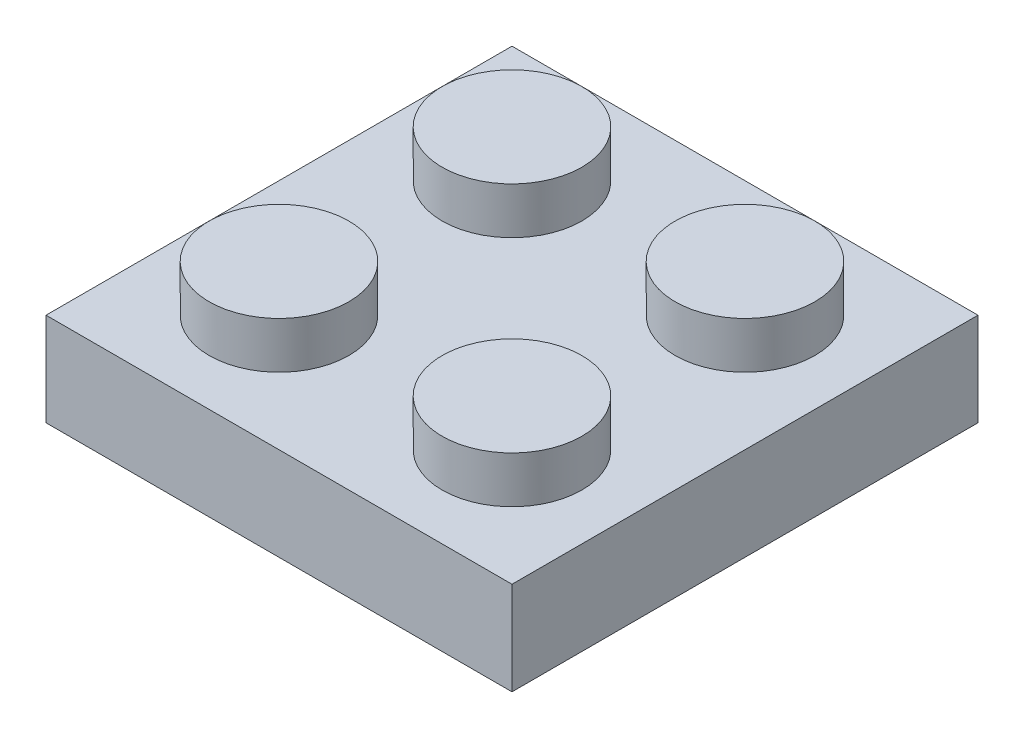
ISO-10303-21;
HEADER;
FILE_DESCRIPTION(('STEP AP214'),'2;1');
FILE_NAME('part.step','',(''),(''),'','','');
FILE_SCHEMA(('AUTOMOTIVE_DESIGN { 1 0 10303 214 1 1 1 1 }'));
ENDSEC;
DATA;
#1=APPLICATION_CONTEXT('core data for automotive mechanical design processes');
#2=APPLICATION_PROTOCOL_DEFINITION('international standard','automotive_design',2000,#1);
#3=PRODUCT_CONTEXT('',#1,'mechanical');
#4=PRODUCT('Part','Part','',(#3));
#5=PRODUCT_RELATED_PRODUCT_CATEGORY('part','',(#4));
#6=PRODUCT_DEFINITION_FORMATION('','',#4);
#7=PRODUCT_DEFINITION_CONTEXT('part definition',#1,'design');
#8=PRODUCT_DEFINITION('design','',#6,#7);
#9=PRODUCT_DEFINITION_SHAPE('','',#8);
#10=(LENGTH_UNIT() NAMED_UNIT(*) SI_UNIT(.MILLI.,.METRE.));
#11=(NAMED_UNIT(*) PLANE_ANGLE_UNIT() SI_UNIT($,.RADIAN.));
#12=(NAMED_UNIT(*) SI_UNIT($,.STERADIAN.) SOLID_ANGLE_UNIT());
#13=UNCERTAINTY_MEASURE_WITH_UNIT(LENGTH_MEASURE(1.E-05),#10,'distance_accuracy_value','');
#14=(GEOMETRIC_REPRESENTATION_CONTEXT(3) GLOBAL_UNCERTAINTY_ASSIGNED_CONTEXT((#13)) GLOBAL_UNIT_ASSIGNED_CONTEXT((#10,
#11,#12)) REPRESENTATION_CONTEXT('',''));
#15=CARTESIAN_POINT('',(0.,0.,0.));
#16=DIRECTION('',(0.,0.,1.));
#17=DIRECTION('',(1.,0.,0.));
#18=AXIS2_PLACEMENT_3D('',#15,#16,#17);
#19=CARTESIAN_POINT('',(12.,1.6,4.));
#20=DIRECTION('',(-1.,0.,0.));
#21=DIRECTION('',(0.,0.,1.));
#22=AXIS2_PLACEMENT_3D('',#19,#20,#21);
#23=PLANE('',#22);
#24=DIRECTION('',(0.,0.,-1.));
#25=VECTOR('',#24,1.);
#26=CARTESIAN_POINT('',(12.,0.,4.));
#27=LINE('',#26,#25);
#28=CARTESIAN_POINT('',(12.,0.,12.));
#29=VERTEX_POINT('',#28);
#30=CARTESIAN_POINT('',(12.,0.,-4.));
#31=VERTEX_POINT('',#30);
#32=EDGE_CURVE('E116',#29,#31,#27,.T.);
#33=ORIENTED_EDGE('',*,*,#32,.T.);
#34=DIRECTION('',(0.,-1.,0.));
#35=VECTOR('',#34,1.);
#36=CARTESIAN_POINT('',(12.,1.6,-4.));
#37=LINE('',#36,#35);
#38=CARTESIAN_POINT('',(12.,3.2,-4.));
#39=VERTEX_POINT('',#38);
#40=EDGE_CURVE('E158',#39,#31,#37,.T.);
#41=ORIENTED_EDGE('',*,*,#40,.F.);
#42=DIRECTION('',(0.,0.,-1.));
#43=VECTOR('',#42,1.);
#44=CARTESIAN_POINT('',(12.,3.2,4.));
#45=LINE('',#44,#43);
#46=CARTESIAN_POINT('',(12.,3.2,12.));
#47=VERTEX_POINT('',#46);
#48=EDGE_CURVE('E11',#47,#39,#45,.T.);
#49=ORIENTED_EDGE('',*,*,#48,.F.);
#50=DIRECTION('',(0.,1.,0.));
#51=VECTOR('',#50,1.);
#52=CARTESIAN_POINT('',(12.,1.6,12.));
#53=LINE('',#52,#51);
#54=EDGE_CURVE('E21',#29,#47,#53,.T.);
#55=ORIENTED_EDGE('',*,*,#54,.F.);
#56=EDGE_LOOP('',(#33,#41,#49,#55));
#57=FACE_BOUND('',#56,.T.);
#58=ADVANCED_FACE('F17',(#57),#23,.F.);
#59=CARTESIAN_POINT('',(4.,3.2,4.));
#60=DIRECTION('',(0.,-1.,0.));
#61=DIRECTION('',(0.,0.,-1.));
#62=AXIS2_PLACEMENT_3D('',#59,#60,#61);
#63=PLANE('',#62);
#64=ORIENTED_EDGE('',*,*,#48,.T.);
#65=DIRECTION('',(1.,0.,0.));
#66=VECTOR('',#65,1.);
#67=CARTESIAN_POINT('',(4.,3.2,-4.));
#68=LINE('',#67,#66);
#69=CARTESIAN_POINT('',(-4.,3.2,-4.));
#70=VERTEX_POINT('',#69);
#71=EDGE_CURVE('E138',#70,#39,#68,.T.);
#72=ORIENTED_EDGE('',*,*,#71,.F.);
#73=DIRECTION('',(0.,0.,-1.));
#74=VECTOR('',#73,1.);
#75=CARTESIAN_POINT('',(-4.,3.2,4.));
#76=LINE('',#75,#74);
#77=CARTESIAN_POINT('',(-4.,3.2,12.));
#78=VERTEX_POINT('',#77);
#79=EDGE_CURVE('E27',#78,#70,#76,.T.);
#80=ORIENTED_EDGE('',*,*,#79,.F.);
#81=DIRECTION('',(-1.,0.,0.));
#82=VECTOR('',#81,1.);
#83=CARTESIAN_POINT('',(4.,3.2,12.));
#84=LINE('',#83,#82);
#85=EDGE_CURVE('E131',#47,#78,#84,.T.);
#86=ORIENTED_EDGE('',*,*,#85,.F.);
#87=EDGE_LOOP('',(#64,#72,#80,#86));
#88=FACE_BOUND('',#87,.T.);
#89=CARTESIAN_POINT('',(0.,3.2,0.));
#90=DIRECTION('',(0.,-1.,0.));
#91=DIRECTION('',(1.,0.,0.));
#92=AXIS2_PLACEMENT_3D('',#89,#90,#91);
#93=CIRCLE('',#92,2.4);
#94=CARTESIAN_POINT('',(-2.4,3.2,0.));
#95=VERTEX_POINT('',#94);
#96=EDGE_CURVE('E143',#95,#95,#93,.T.);
#97=ORIENTED_EDGE('',*,*,#96,.T.);
#98=EDGE_LOOP('',(#97));
#99=FACE_BOUND('',#98,.T.);
#100=CARTESIAN_POINT('',(0.,3.2,8.));
#101=DIRECTION('',(0.,-1.,0.));
#102=DIRECTION('',(1.,0.,0.));
#103=AXIS2_PLACEMENT_3D('',#100,#101,#102);
#104=CIRCLE('',#103,2.4);
#105=CARTESIAN_POINT('',(-2.4,3.2,8.));
#106=VERTEX_POINT('',#105);
#107=EDGE_CURVE('E144',#106,#106,#104,.T.);
#108=ORIENTED_EDGE('',*,*,#107,.T.);
#109=EDGE_LOOP('',(#108));
#110=FACE_BOUND('',#109,.T.);
#111=CARTESIAN_POINT('',(8.,3.2,0.));
#112=DIRECTION('',(0.,-1.,0.));
#113=DIRECTION('',(1.,0.,0.));
#114=AXIS2_PLACEMENT_3D('',#111,#112,#113);
#115=CIRCLE('',#114,2.4);
#116=CARTESIAN_POINT('',(5.6,3.2,0.));
#117=VERTEX_POINT('',#116);
#118=EDGE_CURVE('E84',#117,#117,#115,.T.);
#119=ORIENTED_EDGE('',*,*,#118,.T.);
#120=EDGE_LOOP('',(#119));
#121=FACE_BOUND('',#120,.T.);
#122=CARTESIAN_POINT('',(8.,3.2,8.));
#123=DIRECTION('',(0.,-1.,0.));
#124=DIRECTION('',(1.,0.,0.));
#125=AXIS2_PLACEMENT_3D('',#122,#123,#124);
#126=CIRCLE('',#125,2.4);
#127=CARTESIAN_POINT('',(5.6,3.2,8.));
#128=VERTEX_POINT('',#127);
#129=EDGE_CURVE('E109',#128,#128,#126,.T.);
#130=ORIENTED_EDGE('',*,*,#129,.T.);
#131=EDGE_LOOP('',(#130));
#132=FACE_BOUND('',#131,.T.);
#133=ADVANCED_FACE('F180',(#88,#99,#110,#121,#132),#63,.F.);
#134=CARTESIAN_POINT('',(-4.,1.6,4.));
#135=DIRECTION('',(1.,0.,0.));
#136=DIRECTION('',(0.,0.,-1.));
#137=AXIS2_PLACEMENT_3D('',#134,#135,#136);
#138=PLANE('',#137);
#139=ORIENTED_EDGE('',*,*,#79,.T.);
#140=DIRECTION('',(0.,1.,0.));
#141=VECTOR('',#140,1.);
#142=CARTESIAN_POINT('',(-4.,1.6,-4.));
#143=LINE('',#142,#141);
#144=CARTESIAN_POINT('',(-4.,0.,-4.));
#145=VERTEX_POINT('',#144);
#146=EDGE_CURVE('E135',#145,#70,#143,.T.);
#147=ORIENTED_EDGE('',*,*,#146,.F.);
#148=DIRECTION('',(0.,0.,-1.));
#149=VECTOR('',#148,1.);
#150=CARTESIAN_POINT('',(-4.,0.,4.));
#151=LINE('',#150,#149);
#152=CARTESIAN_POINT('',(-4.,0.,12.));
#153=VERTEX_POINT('',#152);
#154=EDGE_CURVE('E146',#153,#145,#151,.T.);
#155=ORIENTED_EDGE('',*,*,#154,.F.);
#156=DIRECTION('',(0.,-1.,0.));
#157=VECTOR('',#156,1.);
#158=CARTESIAN_POINT('',(-4.,1.6,12.));
#159=LINE('',#158,#157);
#160=EDGE_CURVE('E134',#78,#153,#159,.T.);
#161=ORIENTED_EDGE('',*,*,#160,.F.);
#162=EDGE_LOOP('',(#139,#147,#155,#161));
#163=FACE_BOUND('',#162,.T.);
#164=ADVANCED_FACE('F19',(#163),#138,.F.);
#165=CARTESIAN_POINT('',(4.,0.,4.));
#166=DIRECTION('',(0.,1.,0.));
#167=DIRECTION('',(0.,0.,1.));
#168=AXIS2_PLACEMENT_3D('',#165,#166,#167);
#169=PLANE('',#168);
#170=ORIENTED_EDGE('',*,*,#154,.T.);
#171=DIRECTION('',(-1.,0.,0.));
#172=VECTOR('',#171,1.);
#173=CARTESIAN_POINT('',(4.,0.,-4.));
#174=LINE('',#173,#172);
#175=EDGE_CURVE('E139',#31,#145,#174,.T.);
#176=ORIENTED_EDGE('',*,*,#175,.F.);
#177=ORIENTED_EDGE('',*,*,#32,.F.);
#178=DIRECTION('',(1.,0.,0.));
#179=VECTOR('',#178,1.);
#180=CARTESIAN_POINT('',(4.,0.,12.));
#181=LINE('',#180,#179);
#182=EDGE_CURVE('E151',#153,#29,#181,.T.);
#183=ORIENTED_EDGE('',*,*,#182,.F.);
#184=EDGE_LOOP('',(#170,#176,#177,#183));
#185=FACE_BOUND('',#184,.T.);
#186=CARTESIAN_POINT('',(0.,0.,0.));
#187=DIRECTION('',(0.,1.,0.));
#188=DIRECTION('',(1.,0.,0.));
#189=AXIS2_PLACEMENT_3D('',#186,#187,#188);
#190=CIRCLE('',#189,2.4);
#191=CARTESIAN_POINT('',(-2.4,0.,0.));
#192=VERTEX_POINT('',#191);
#193=EDGE_CURVE('E99',#192,#192,#190,.T.);
#194=ORIENTED_EDGE('',*,*,#193,.T.);
#195=EDGE_LOOP('',(#194));
#196=FACE_BOUND('',#195,.T.);
#197=CARTESIAN_POINT('',(0.,0.,8.));
#198=DIRECTION('',(0.,1.,0.));
#199=DIRECTION('',(1.,0.,0.));
#200=AXIS2_PLACEMENT_3D('',#197,#198,#199);
#201=CIRCLE('',#200,2.4);
#202=CARTESIAN_POINT('',(-2.4,0.,8.));
#203=VERTEX_POINT('',#202);
#204=EDGE_CURVE('E117',#203,#203,#201,.T.);
#205=ORIENTED_EDGE('',*,*,#204,.T.);
#206=EDGE_LOOP('',(#205));
#207=FACE_BOUND('',#206,.T.);
#208=CARTESIAN_POINT('',(8.,0.,0.));
#209=DIRECTION('',(0.,1.,0.));
#210=DIRECTION('',(1.,0.,0.));
#211=AXIS2_PLACEMENT_3D('',#208,#209,#210);
#212=CIRCLE('',#211,2.4);
#213=CARTESIAN_POINT('',(5.6,0.,0.));
#214=VERTEX_POINT('',#213);
#215=EDGE_CURVE('E123',#214,#214,#212,.T.);
#216=ORIENTED_EDGE('',*,*,#215,.T.);
#217=EDGE_LOOP('',(#216));
#218=FACE_BOUND('',#217,.T.);
#219=CARTESIAN_POINT('',(8.,0.,8.));
#220=DIRECTION('',(0.,1.,0.));
#221=DIRECTION('',(1.,0.,0.));
#222=AXIS2_PLACEMENT_3D('',#219,#220,#221);
#223=CIRCLE('',#222,2.4);
#224=CARTESIAN_POINT('',(5.6,0.,8.));
#225=VERTEX_POINT('',#224);
#226=EDGE_CURVE('E126',#225,#225,#223,.T.);
#227=ORIENTED_EDGE('',*,*,#226,.T.);
#228=EDGE_LOOP('',(#227));
#229=FACE_BOUND('',#228,.T.);
#230=CARTESIAN_POINT('',(4.,0.,4.));
#231=DIRECTION('',(0.,1.,0.));
#232=DIRECTION('',(1.,0.,0.));
#233=AXIS2_PLACEMENT_3D('',#230,#231,#232);
#234=CIRCLE('',#233,2.4);
#235=CARTESIAN_POINT('',(1.6,0.,4.));
#236=VERTEX_POINT('',#235);
#237=EDGE_CURVE('E127',#236,#236,#234,.T.);
#238=ORIENTED_EDGE('',*,*,#237,.T.);
#239=EDGE_LOOP('',(#238));
#240=FACE_BOUND('',#239,.T.);
#241=ADVANCED_FACE('F276',(#185,#196,#207,#218,#229,#240),#169,.F.);
#242=CARTESIAN_POINT('',(4.,1.6,-4.));
#243=DIRECTION('',(0.,0.,1.));
#244=DIRECTION('',(1.,0.,0.));
#245=AXIS2_PLACEMENT_3D('',#242,#243,#244);
#246=PLANE('',#245);
#247=ORIENTED_EDGE('',*,*,#40,.T.);
#248=ORIENTED_EDGE('',*,*,#175,.T.);
#249=ORIENTED_EDGE('',*,*,#146,.T.);
#250=ORIENTED_EDGE('',*,*,#71,.T.);
#251=EDGE_LOOP('',(#247,#248,#249,#250));
#252=FACE_BOUND('',#251,.T.);
#253=ADVANCED_FACE('F275',(#252),#246,.F.);
#254=CARTESIAN_POINT('',(4.,1.6,12.));
#255=DIRECTION('',(0.,0.,1.));
#256=DIRECTION('',(1.,0.,0.));
#257=AXIS2_PLACEMENT_3D('',#254,#255,#256);
#258=PLANE('',#257);
#259=ORIENTED_EDGE('',*,*,#54,.T.);
#260=ORIENTED_EDGE('',*,*,#85,.T.);
#261=ORIENTED_EDGE('',*,*,#160,.T.);
#262=ORIENTED_EDGE('',*,*,#182,.T.);
#263=EDGE_LOOP('',(#259,#260,#261,#262));
#264=FACE_BOUND('',#263,.T.);
#265=ADVANCED_FACE('F169',(#264),#258,.T.);
#266=CARTESIAN_POINT('',(0.,4.8,0.));
#267=DIRECTION('',(0.,1.,0.));
#268=DIRECTION('',(1.,0.,0.));
#269=AXIS2_PLACEMENT_3D('',#266,#267,#268);
#270=PLANE('',#269);
#271=CARTESIAN_POINT('',(0.,4.8,0.));
#272=DIRECTION('',(0.,1.,0.));
#273=DIRECTION('',(1.,0.,0.));
#274=AXIS2_PLACEMENT_3D('',#271,#272,#273);
#275=CIRCLE('',#274,2.4);
#276=CARTESIAN_POINT('',(2.4,4.8,0.));
#277=VERTEX_POINT('',#276);
#278=EDGE_CURVE('E140',#277,#277,#275,.T.);
#279=ORIENTED_EDGE('',*,*,#278,.T.);
#280=EDGE_LOOP('',(#279));
#281=FACE_BOUND('',#280,.T.);
#282=ADVANCED_FACE('F190',(#281),#270,.T.);
#283=CARTESIAN_POINT('',(0.,3.75,0.));
#284=DIRECTION('',(0.,-1.,0.));
#285=DIRECTION('',(1.,0.,0.));
#286=AXIS2_PLACEMENT_3D('',#283,#284,#285);
#287=CYLINDRICAL_SURFACE('',#286,2.4);
#288=ORIENTED_EDGE('',*,*,#96,.F.);
#289=EDGE_LOOP('',(#288));
#290=FACE_BOUND('',#289,.T.);
#291=ORIENTED_EDGE('',*,*,#278,.F.);
#292=EDGE_LOOP('',(#291));
#293=FACE_BOUND('',#292,.T.);
#294=ADVANCED_FACE('F192',(#290,#293),#287,.T.);
#295=CARTESIAN_POINT('',(0.,4.8,8.));
#296=DIRECTION('',(0.,1.,0.));
#297=DIRECTION('',(1.,0.,0.));
#298=AXIS2_PLACEMENT_3D('',#295,#296,#297);
#299=PLANE('',#298);
#300=CARTESIAN_POINT('',(0.,4.8,8.));
#301=DIRECTION('',(0.,1.,0.));
#302=DIRECTION('',(1.,0.,0.));
#303=AXIS2_PLACEMENT_3D('',#300,#301,#302);
#304=CIRCLE('',#303,2.4);
#305=CARTESIAN_POINT('',(2.4,4.8,8.));
#306=VERTEX_POINT('',#305);
#307=EDGE_CURVE('E156',#306,#306,#304,.T.);
#308=ORIENTED_EDGE('',*,*,#307,.T.);
#309=EDGE_LOOP('',(#308));
#310=FACE_BOUND('',#309,.T.);
#311=ADVANCED_FACE('F194',(#310),#299,.T.);
#312=CARTESIAN_POINT('',(0.,3.75,8.));
#313=DIRECTION('',(0.,-1.,0.));
#314=DIRECTION('',(1.,0.,0.));
#315=AXIS2_PLACEMENT_3D('',#312,#313,#314);
#316=CYLINDRICAL_SURFACE('',#315,2.4);
#317=ORIENTED_EDGE('',*,*,#107,.F.);
#318=EDGE_LOOP('',(#317));
#319=FACE_BOUND('',#318,.T.);
#320=ORIENTED_EDGE('',*,*,#307,.F.);
#321=EDGE_LOOP('',(#320));
#322=FACE_BOUND('',#321,.T.);
#323=ADVANCED_FACE('F202',(#319,#322),#316,.T.);
#324=CARTESIAN_POINT('',(8.,4.8,0.));
#325=DIRECTION('',(0.,1.,0.));
#326=DIRECTION('',(1.,0.,0.));
#327=AXIS2_PLACEMENT_3D('',#324,#325,#326);
#328=PLANE('',#327);
#329=CARTESIAN_POINT('',(8.,4.8,0.));
#330=DIRECTION('',(0.,1.,0.));
#331=DIRECTION('',(1.,0.,0.));
#332=AXIS2_PLACEMENT_3D('',#329,#330,#331);
#333=CIRCLE('',#332,2.4);
#334=CARTESIAN_POINT('',(10.4,4.8,0.));
#335=VERTEX_POINT('',#334);
#336=EDGE_CURVE('E79',#335,#335,#333,.T.);
#337=ORIENTED_EDGE('',*,*,#336,.T.);
#338=EDGE_LOOP('',(#337));
#339=FACE_BOUND('',#338,.T.);
#340=ADVANCED_FACE('F228',(#339),#328,.T.);
#341=CARTESIAN_POINT('',(8.,3.75,0.));
#342=DIRECTION('',(0.,-1.,0.));
#343=DIRECTION('',(1.,0.,0.));
#344=AXIS2_PLACEMENT_3D('',#341,#342,#343);
#345=CYLINDRICAL_SURFACE('',#344,2.4);
#346=ORIENTED_EDGE('',*,*,#118,.F.);
#347=EDGE_LOOP('',(#346));
#348=FACE_BOUND('',#347,.T.);
#349=ORIENTED_EDGE('',*,*,#336,.F.);
#350=EDGE_LOOP('',(#349));
#351=FACE_BOUND('',#350,.T.);
#352=ADVANCED_FACE('F226',(#348,#351),#345,.T.);
#353=CARTESIAN_POINT('',(8.,4.8,8.));
#354=DIRECTION('',(0.,1.,0.));
#355=DIRECTION('',(1.,0.,0.));
#356=AXIS2_PLACEMENT_3D('',#353,#354,#355);
#357=PLANE('',#356);
#358=CARTESIAN_POINT('',(8.,4.8,8.));
#359=DIRECTION('',(0.,1.,0.));
#360=DIRECTION('',(1.,0.,0.));
#361=AXIS2_PLACEMENT_3D('',#358,#359,#360);
#362=CIRCLE('',#361,2.4);
#363=CARTESIAN_POINT('',(10.4,4.8,8.));
#364=VERTEX_POINT('',#363);
#365=EDGE_CURVE('E107',#364,#364,#362,.T.);
#366=ORIENTED_EDGE('',*,*,#365,.T.);
#367=EDGE_LOOP('',(#366));
#368=FACE_BOUND('',#367,.T.);
#369=ADVANCED_FACE('F224',(#368),#357,.T.);
#370=CARTESIAN_POINT('',(8.,3.75,8.));
#371=DIRECTION('',(0.,-1.,0.));
#372=DIRECTION('',(1.,0.,0.));
#373=AXIS2_PLACEMENT_3D('',#370,#371,#372);
#374=CYLINDRICAL_SURFACE('',#373,2.4);
#375=ORIENTED_EDGE('',*,*,#129,.F.);
#376=EDGE_LOOP('',(#375));
#377=FACE_BOUND('',#376,.T.);
#378=ORIENTED_EDGE('',*,*,#365,.F.);
#379=EDGE_LOOP('',(#378));
#380=FACE_BOUND('',#379,.T.);
#381=ADVANCED_FACE('F221',(#377,#380),#374,.T.);
#382=CARTESIAN_POINT('',(0.,1.6,0.));
#383=DIRECTION('',(0.,1.,0.));
#384=DIRECTION('',(1.,0.,0.));
#385=AXIS2_PLACEMENT_3D('',#382,#383,#384);
#386=PLANE('',#385);
#387=CARTESIAN_POINT('',(0.,1.6,0.));
#388=DIRECTION('',(0.,1.,0.));
#389=DIRECTION('',(1.,0.,0.));
#390=AXIS2_PLACEMENT_3D('',#387,#388,#389);
#391=CIRCLE('',#390,2.4);
#392=CARTESIAN_POINT('',(2.4,1.6,0.));
#393=VERTEX_POINT('',#392);
#394=EDGE_CURVE('E103',#393,#393,#391,.T.);
#395=ORIENTED_EDGE('',*,*,#394,.F.);
#396=EDGE_LOOP('',(#395));
#397=FACE_BOUND('',#396,.T.);
#398=ADVANCED_FACE('F223',(#397),#386,.F.);
#399=CARTESIAN_POINT('',(0.,0.55,0.));
#400=DIRECTION('',(0.,-1.,0.));
#401=DIRECTION('',(1.,0.,0.));
#402=AXIS2_PLACEMENT_3D('',#399,#400,#401);
#403=CYLINDRICAL_SURFACE('',#402,2.4);
#404=ORIENTED_EDGE('',*,*,#394,.T.);
#405=EDGE_LOOP('',(#404));
#406=FACE_BOUND('',#405,.T.);
#407=ORIENTED_EDGE('',*,*,#193,.F.);
#408=EDGE_LOOP('',(#407));
#409=FACE_BOUND('',#408,.T.);
#410=ADVANCED_FACE('F104',(#406,#409),#403,.F.);
#411=CARTESIAN_POINT('',(0.,1.6,8.));
#412=DIRECTION('',(0.,1.,0.));
#413=DIRECTION('',(1.,0.,0.));
#414=AXIS2_PLACEMENT_3D('',#411,#412,#413);
#415=PLANE('',#414);
#416=CARTESIAN_POINT('',(0.,1.6,8.));
#417=DIRECTION('',(0.,1.,0.));
#418=DIRECTION('',(1.,0.,0.));
#419=AXIS2_PLACEMENT_3D('',#416,#417,#418);
#420=CIRCLE('',#419,2.4);
#421=CARTESIAN_POINT('',(2.4,1.6,8.));
#422=VERTEX_POINT('',#421);
#423=EDGE_CURVE('E111',#422,#422,#420,.T.);
#424=ORIENTED_EDGE('',*,*,#423,.F.);
#425=EDGE_LOOP('',(#424));
#426=FACE_BOUND('',#425,.T.);
#427=ADVANCED_FACE('F250',(#426),#415,.F.);
#428=CARTESIAN_POINT('',(0.,0.55,8.));
#429=DIRECTION('',(0.,-1.,0.));
#430=DIRECTION('',(1.,0.,0.));
#431=AXIS2_PLACEMENT_3D('',#428,#429,#430);
#432=CYLINDRICAL_SURFACE('',#431,2.4);
#433=ORIENTED_EDGE('',*,*,#423,.T.);
#434=EDGE_LOOP('',(#433));
#435=FACE_BOUND('',#434,.T.);
#436=ORIENTED_EDGE('',*,*,#204,.F.);
#437=EDGE_LOOP('',(#436));
#438=FACE_BOUND('',#437,.T.);
#439=ADVANCED_FACE('F253',(#435,#438),#432,.F.);
#440=CARTESIAN_POINT('',(8.,1.6,0.));
#441=DIRECTION('',(0.,1.,0.));
#442=DIRECTION('',(1.,0.,0.));
#443=AXIS2_PLACEMENT_3D('',#440,#441,#442);
#444=PLANE('',#443);
#445=CARTESIAN_POINT('',(8.,1.6,0.));
#446=DIRECTION('',(0.,1.,0.));
#447=DIRECTION('',(1.,0.,0.));
#448=AXIS2_PLACEMENT_3D('',#445,#446,#447);
#449=CIRCLE('',#448,2.4);
#450=CARTESIAN_POINT('',(10.4,1.6,0.));
#451=VERTEX_POINT('',#450);
#452=EDGE_CURVE('E119',#451,#451,#449,.T.);
#453=ORIENTED_EDGE('',*,*,#452,.F.);
#454=EDGE_LOOP('',(#453));
#455=FACE_BOUND('',#454,.T.);
#456=ADVANCED_FACE('F255',(#455),#444,.F.);
#457=CARTESIAN_POINT('',(8.,0.55,0.));
#458=DIRECTION('',(0.,-1.,0.));
#459=DIRECTION('',(1.,0.,0.));
#460=AXIS2_PLACEMENT_3D('',#457,#458,#459);
#461=CYLINDRICAL_SURFACE('',#460,2.4);
#462=ORIENTED_EDGE('',*,*,#452,.T.);
#463=EDGE_LOOP('',(#462));
#464=FACE_BOUND('',#463,.T.);
#465=ORIENTED_EDGE('',*,*,#215,.F.);
#466=EDGE_LOOP('',(#465));
#467=FACE_BOUND('',#466,.T.);
#468=ADVANCED_FACE('F258',(#464,#467),#461,.F.);
#469=CARTESIAN_POINT('',(8.,1.6,8.));
#470=DIRECTION('',(0.,1.,0.));
#471=DIRECTION('',(1.,0.,0.));
#472=AXIS2_PLACEMENT_3D('',#469,#470,#471);
#473=PLANE('',#472);
#474=CARTESIAN_POINT('',(8.,1.6,8.));
#475=DIRECTION('',(0.,1.,0.));
#476=DIRECTION('',(1.,0.,0.));
#477=AXIS2_PLACEMENT_3D('',#474,#475,#476);
#478=CIRCLE('',#477,2.4);
#479=CARTESIAN_POINT('',(10.4,1.6,8.));
#480=VERTEX_POINT('',#479);
#481=EDGE_CURVE('E130',#480,#480,#478,.T.);
#482=ORIENTED_EDGE('',*,*,#481,.F.);
#483=EDGE_LOOP('',(#482));
#484=FACE_BOUND('',#483,.T.);
#485=ADVANCED_FACE('F248',(#484),#473,.F.);
#486=CARTESIAN_POINT('',(8.,0.55,8.));
#487=DIRECTION('',(0.,-1.,0.));
#488=DIRECTION('',(1.,0.,0.));
#489=AXIS2_PLACEMENT_3D('',#486,#487,#488);
#490=CYLINDRICAL_SURFACE('',#489,2.4);
#491=ORIENTED_EDGE('',*,*,#481,.T.);
#492=EDGE_LOOP('',(#491));
#493=FACE_BOUND('',#492,.T.);
#494=ORIENTED_EDGE('',*,*,#226,.F.);
#495=EDGE_LOOP('',(#494));
#496=FACE_BOUND('',#495,.T.);
#497=ADVANCED_FACE('F245',(#493,#496),#490,.F.);
#498=CARTESIAN_POINT('',(4.,1.6,4.));
#499=DIRECTION('',(0.,1.,0.));
#500=DIRECTION('',(1.,0.,0.));
#501=AXIS2_PLACEMENT_3D('',#498,#499,#500);
#502=PLANE('',#501);
#503=CARTESIAN_POINT('',(4.,1.6,4.));
#504=DIRECTION('',(0.,1.,0.));
#505=DIRECTION('',(1.,0.,0.));
#506=AXIS2_PLACEMENT_3D('',#503,#504,#505);
#507=CIRCLE('',#506,2.4);
#508=CARTESIAN_POINT('',(6.4,1.6,4.));
#509=VERTEX_POINT('',#508);
#510=EDGE_CURVE('E124',#509,#509,#507,.T.);
#511=ORIENTED_EDGE('',*,*,#510,.F.);
#512=EDGE_LOOP('',(#511));
#513=FACE_BOUND('',#512,.T.);
#514=ADVANCED_FACE('F219',(#513),#502,.F.);
#515=CARTESIAN_POINT('',(4.,0.55,4.));
#516=DIRECTION('',(0.,-1.,0.));
#517=DIRECTION('',(1.,0.,0.));
#518=AXIS2_PLACEMENT_3D('',#515,#516,#517);
#519=CYLINDRICAL_SURFACE('',#518,2.4);
#520=ORIENTED_EDGE('',*,*,#510,.T.);
#521=EDGE_LOOP('',(#520));
#522=FACE_BOUND('',#521,.T.);
#523=ORIENTED_EDGE('',*,*,#237,.F.);
#524=EDGE_LOOP('',(#523));
#525=FACE_BOUND('',#524,.T.);
#526=ADVANCED_FACE('F216',(#522,#525),#519,.F.);
#527=CLOSED_SHELL('',(#58,#133,#164,#241,#253,#265,#282,#294,#311,#323,#340,#352,#369,#381,#398,
#410,#427,#439,#456,#468,#485,#497,#514,#526));
#528=MANIFOLD_SOLID_BREP('B1',#527);
#529=ADVANCED_BREP_SHAPE_REPRESENTATION('',(#18,#528),#14);
#530=SHAPE_DEFINITION_REPRESENTATION(#9,#529);
ENDSEC;
END-ISO-10303-21;
